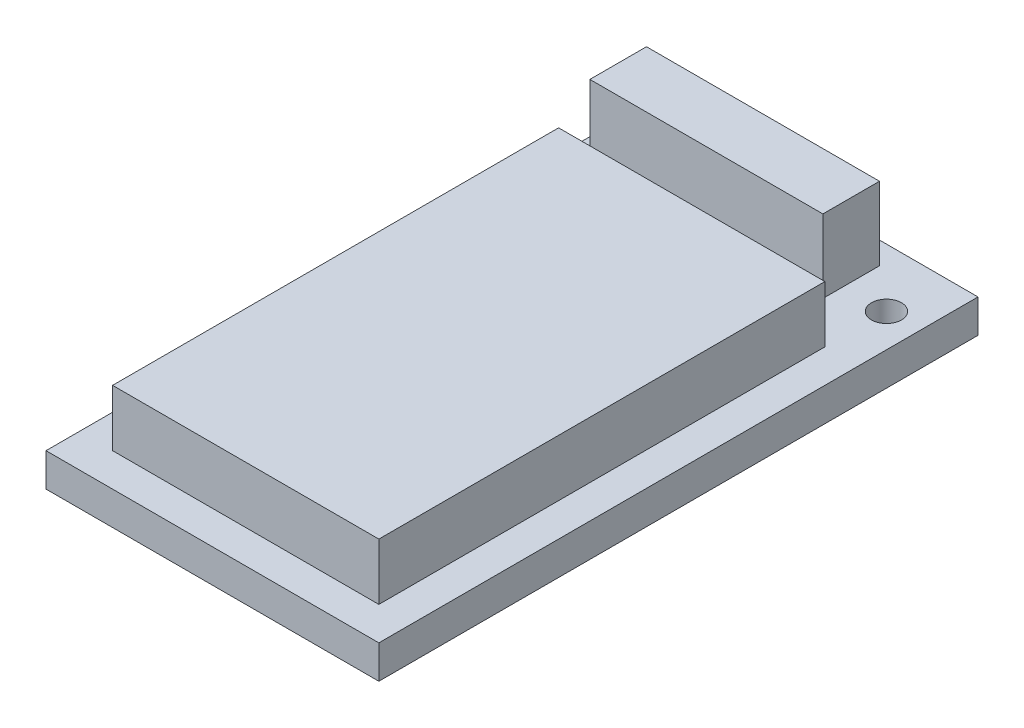
ISO-10303-21;
HEADER;
FILE_DESCRIPTION(('STEP AP214'),'2;1');
FILE_NAME('part.step','',(''),(''),'','','');
FILE_SCHEMA(('AUTOMOTIVE_DESIGN { 1 0 10303 214 1 1 1 1 }'));
ENDSEC;
DATA;
#1=APPLICATION_CONTEXT('core data for automotive mechanical design processes');
#2=APPLICATION_PROTOCOL_DEFINITION('international standard','automotive_design',2000,#1);
#3=PRODUCT_CONTEXT('',#1,'mechanical');
#4=PRODUCT('Part','Part','',(#3));
#5=PRODUCT_RELATED_PRODUCT_CATEGORY('part','',(#4));
#6=PRODUCT_DEFINITION_FORMATION('','',#4);
#7=PRODUCT_DEFINITION_CONTEXT('part definition',#1,'design');
#8=PRODUCT_DEFINITION('design','',#6,#7);
#9=PRODUCT_DEFINITION_SHAPE('','',#8);
#10=(LENGTH_UNIT() NAMED_UNIT(*) SI_UNIT(.MILLI.,.METRE.));
#11=(NAMED_UNIT(*) PLANE_ANGLE_UNIT() SI_UNIT($,.RADIAN.));
#12=(NAMED_UNIT(*) SI_UNIT($,.STERADIAN.) SOLID_ANGLE_UNIT());
#13=UNCERTAINTY_MEASURE_WITH_UNIT(LENGTH_MEASURE(1.E-05),#10,'distance_accuracy_value','');
#14=(GEOMETRIC_REPRESENTATION_CONTEXT(3) GLOBAL_UNCERTAINTY_ASSIGNED_CONTEXT((#13)) GLOBAL_UNIT_ASSIGNED_CONTEXT((#10,
#11,#12)) REPRESENTATION_CONTEXT('',''));
#15=CARTESIAN_POINT('',(0.,0.,0.));
#16=DIRECTION('',(0.,0.,1.));
#17=DIRECTION('',(1.,0.,0.));
#18=AXIS2_PLACEMENT_3D('',#15,#16,#17);
#19=CARTESIAN_POINT('',(0.,1.,0.));
#20=DIRECTION('',(0.,1.,0.));
#21=DIRECTION('',(0.,0.,1.));
#22=AXIS2_PLACEMENT_3D('',#19,#20,#21);
#23=PLANE('',#22);
#24=CARTESIAN_POINT('',(4.,1.,-7.25));
#25=DIRECTION('',(0.,1.,0.));
#26=DIRECTION('',(0.,0.,1.));
#27=AXIS2_PLACEMENT_3D('',#24,#25,#26);
#28=CIRCLE('',#27,0.449999999999987);
#29=CARTESIAN_POINT('',(4.,1.,-6.80000000000001));
#30=VERTEX_POINT('',#29);
#31=EDGE_CURVE('E37',#30,#30,#28,.T.);
#32=ORIENTED_EDGE('',*,*,#31,.F.);
#33=EDGE_LOOP('',(#32));
#34=FACE_BOUND('',#33,.T.);
#35=DIRECTION('',(-1.,0.,0.));
#36=VECTOR('',#35,1.);
#37=CARTESIAN_POINT('',(5.,1.,-9.));
#38=LINE('',#37,#36);
#39=CARTESIAN_POINT('',(5.,1.,-9.));
#40=VERTEX_POINT('',#39);
#41=CARTESIAN_POINT('',(-5.,1.,-9.));
#42=VERTEX_POINT('',#41);
#43=EDGE_CURVE('E180',#40,#42,#38,.T.);
#44=ORIENTED_EDGE('',*,*,#43,.T.);
#45=DIRECTION('',(0.,0.,1.));
#46=VECTOR('',#45,1.);
#47=CARTESIAN_POINT('',(-5.,1.,-9.));
#48=LINE('',#47,#46);
#49=CARTESIAN_POINT('',(-5.,1.,9.));
#50=VERTEX_POINT('',#49);
#51=EDGE_CURVE('E197',#42,#50,#48,.T.);
#52=ORIENTED_EDGE('',*,*,#51,.T.);
#53=DIRECTION('',(1.,0.,0.));
#54=VECTOR('',#53,1.);
#55=CARTESIAN_POINT('',(-5.,1.,9.));
#56=LINE('',#55,#54);
#57=CARTESIAN_POINT('',(5.,1.,9.));
#58=VERTEX_POINT('',#57);
#59=EDGE_CURVE('E200',#50,#58,#56,.T.);
#60=ORIENTED_EDGE('',*,*,#59,.T.);
#61=DIRECTION('',(0.,0.,-1.));
#62=VECTOR('',#61,1.);
#63=CARTESIAN_POINT('',(5.,1.,9.));
#64=LINE('',#63,#62);
#65=EDGE_CURVE('E185',#58,#40,#64,.T.);
#66=ORIENTED_EDGE('',*,*,#65,.T.);
#67=EDGE_LOOP('',(#44,#52,#60,#66));
#68=FACE_BOUND('',#67,.T.);
#69=DIRECTION('',(1.,0.,0.));
#70=VECTOR('',#69,1.);
#71=CARTESIAN_POINT('',(4.,1.,8.));
#72=LINE('',#71,#70);
#73=CARTESIAN_POINT('',(-4.,1.,8.));
#74=VERTEX_POINT('',#73);
#75=CARTESIAN_POINT('',(4.,1.,8.));
#76=VERTEX_POINT('',#75);
#77=EDGE_CURVE('E152',#74,#76,#72,.T.);
#78=ORIENTED_EDGE('',*,*,#77,.F.);
#79=DIRECTION('',(0.,0.,1.));
#80=VECTOR('',#79,1.);
#81=CARTESIAN_POINT('',(-4.,1.,8.));
#82=LINE('',#81,#80);
#83=CARTESIAN_POINT('',(-4.,1.,-5.4));
#84=VERTEX_POINT('',#83);
#85=EDGE_CURVE('E149',#84,#74,#82,.T.);
#86=ORIENTED_EDGE('',*,*,#85,.F.);
#87=DIRECTION('',(-1.,0.,0.));
#88=VECTOR('',#87,1.);
#89=CARTESIAN_POINT('',(-4.,1.,-5.4));
#90=LINE('',#89,#88);
#91=CARTESIAN_POINT('',(4.,1.,-5.4));
#92=VERTEX_POINT('',#91);
#93=EDGE_CURVE('E161',#92,#84,#90,.T.);
#94=ORIENTED_EDGE('',*,*,#93,.F.);
#95=DIRECTION('',(0.,0.,-1.));
#96=VECTOR('',#95,1.);
#97=CARTESIAN_POINT('',(4.,1.,-5.4));
#98=LINE('',#97,#96);
#99=EDGE_CURVE('E169',#76,#92,#98,.T.);
#100=ORIENTED_EDGE('',*,*,#99,.F.);
#101=EDGE_LOOP('',(#78,#86,#94,#100));
#102=FACE_BOUND('',#101,.T.);
#103=DIRECTION('',(1.,0.,0.));
#104=VECTOR('',#103,1.);
#105=CARTESIAN_POINT('',(2.71,1.,-6.63));
#106=LINE('',#105,#104);
#107=CARTESIAN_POINT('',(-4.29,1.,-6.63));
#108=VERTEX_POINT('',#107);
#109=CARTESIAN_POINT('',(2.71,1.,-6.63));
#110=VERTEX_POINT('',#109);
#111=EDGE_CURVE('E292',#108,#110,#106,.T.);
#112=ORIENTED_EDGE('',*,*,#111,.F.);
#113=DIRECTION('',(0.,0.,1.));
#114=VECTOR('',#113,1.);
#115=CARTESIAN_POINT('',(-4.29,1.,-6.63));
#116=LINE('',#115,#114);
#117=CARTESIAN_POINT('',(-4.29,1.,-8.33));
#118=VERTEX_POINT('',#117);
#119=EDGE_CURVE('E147',#118,#108,#116,.T.);
#120=ORIENTED_EDGE('',*,*,#119,.F.);
#121=DIRECTION('',(-1.,0.,0.));
#122=VECTOR('',#121,1.);
#123=CARTESIAN_POINT('',(-4.29,1.,-8.33));
#124=LINE('',#123,#122);
#125=CARTESIAN_POINT('',(2.71,1.,-8.33));
#126=VERTEX_POINT('',#125);
#127=EDGE_CURVE('E143',#126,#118,#124,.T.);
#128=ORIENTED_EDGE('',*,*,#127,.F.);
#129=DIRECTION('',(0.,0.,-1.));
#130=VECTOR('',#129,1.);
#131=CARTESIAN_POINT('',(2.71,1.,-8.33));
#132=LINE('',#131,#130);
#133=EDGE_CURVE('E294',#110,#126,#132,.T.);
#134=ORIENTED_EDGE('',*,*,#133,.F.);
#135=EDGE_LOOP('',(#112,#120,#128,#134));
#136=FACE_BOUND('',#135,.T.);
#137=ADVANCED_FACE('F33',(#34,#68,#102,#136),#23,.T.);
#138=CARTESIAN_POINT('',(5.,0.,-9.));
#139=DIRECTION('',(0.,0.,-1.));
#140=DIRECTION('',(-1.,0.,0.));
#141=AXIS2_PLACEMENT_3D('',#138,#139,#140);
#142=PLANE('',#141);
#143=ORIENTED_EDGE('',*,*,#43,.F.);
#144=DIRECTION('',(0.,1.,0.));
#145=VECTOR('',#144,1.);
#146=CARTESIAN_POINT('',(5.,0.,-9.));
#147=LINE('',#146,#145);
#148=CARTESIAN_POINT('',(5.,0.,-9.));
#149=VERTEX_POINT('',#148);
#150=EDGE_CURVE('E11',#149,#40,#147,.T.);
#151=ORIENTED_EDGE('',*,*,#150,.F.);
#152=DIRECTION('',(-1.,0.,0.));
#153=VECTOR('',#152,1.);
#154=CARTESIAN_POINT('',(5.,0.,-9.));
#155=LINE('',#154,#153);
#156=CARTESIAN_POINT('',(-5.,0.,-9.));
#157=VERTEX_POINT('',#156);
#158=EDGE_CURVE('E181',#149,#157,#155,.T.);
#159=ORIENTED_EDGE('',*,*,#158,.T.);
#160=DIRECTION('',(0.,1.,0.));
#161=VECTOR('',#160,1.);
#162=CARTESIAN_POINT('',(-5.,0.,-9.));
#163=LINE('',#162,#161);
#164=EDGE_CURVE('E194',#157,#42,#163,.T.);
#165=ORIENTED_EDGE('',*,*,#164,.T.);
#166=EDGE_LOOP('',(#143,#151,#159,#165));
#167=FACE_BOUND('',#166,.T.);
#168=ADVANCED_FACE('F35',(#167),#142,.T.);
#169=CARTESIAN_POINT('',(5.,0.,9.));
#170=DIRECTION('',(1.,0.,0.));
#171=DIRECTION('',(0.,0.,-1.));
#172=AXIS2_PLACEMENT_3D('',#169,#170,#171);
#173=PLANE('',#172);
#174=ORIENTED_EDGE('',*,*,#65,.F.);
#175=DIRECTION('',(0.,1.,0.));
#176=VECTOR('',#175,1.);
#177=CARTESIAN_POINT('',(5.,0.,9.));
#178=LINE('',#177,#176);
#179=CARTESIAN_POINT('',(5.,0.,9.));
#180=VERTEX_POINT('',#179);
#181=EDGE_CURVE('E42',#180,#58,#178,.T.);
#182=ORIENTED_EDGE('',*,*,#181,.F.);
#183=DIRECTION('',(0.,0.,-1.));
#184=VECTOR('',#183,1.);
#185=CARTESIAN_POINT('',(5.,0.,9.));
#186=LINE('',#185,#184);
#187=EDGE_CURVE('E191',#180,#149,#186,.T.);
#188=ORIENTED_EDGE('',*,*,#187,.T.);
#189=ORIENTED_EDGE('',*,*,#150,.T.);
#190=EDGE_LOOP('',(#174,#182,#188,#189));
#191=FACE_BOUND('',#190,.T.);
#192=ADVANCED_FACE('F219',(#191),#173,.T.);
#193=CARTESIAN_POINT('',(-5.,0.,9.));
#194=DIRECTION('',(0.,0.,1.));
#195=DIRECTION('',(1.,0.,0.));
#196=AXIS2_PLACEMENT_3D('',#193,#194,#195);
#197=PLANE('',#196);
#198=ORIENTED_EDGE('',*,*,#59,.F.);
#199=DIRECTION('',(0.,1.,0.));
#200=VECTOR('',#199,1.);
#201=CARTESIAN_POINT('',(-5.,0.,9.));
#202=LINE('',#201,#200);
#203=CARTESIAN_POINT('',(-5.,0.,9.));
#204=VERTEX_POINT('',#203);
#205=EDGE_CURVE('E206',#204,#50,#202,.T.);
#206=ORIENTED_EDGE('',*,*,#205,.F.);
#207=DIRECTION('',(1.,0.,0.));
#208=VECTOR('',#207,1.);
#209=CARTESIAN_POINT('',(-5.,0.,9.));
#210=LINE('',#209,#208);
#211=EDGE_CURVE('E188',#204,#180,#210,.T.);
#212=ORIENTED_EDGE('',*,*,#211,.T.);
#213=ORIENTED_EDGE('',*,*,#181,.T.);
#214=EDGE_LOOP('',(#198,#206,#212,#213));
#215=FACE_BOUND('',#214,.T.);
#216=ADVANCED_FACE('F225',(#215),#197,.T.);
#217=CARTESIAN_POINT('',(-5.,0.,-9.));
#218=DIRECTION('',(-1.,0.,0.));
#219=DIRECTION('',(0.,0.,1.));
#220=AXIS2_PLACEMENT_3D('',#217,#218,#219);
#221=PLANE('',#220);
#222=ORIENTED_EDGE('',*,*,#51,.F.);
#223=ORIENTED_EDGE('',*,*,#164,.F.);
#224=DIRECTION('',(0.,0.,1.));
#225=VECTOR('',#224,1.);
#226=CARTESIAN_POINT('',(-5.,0.,-9.));
#227=LINE('',#226,#225);
#228=EDGE_CURVE('E184',#157,#204,#227,.T.);
#229=ORIENTED_EDGE('',*,*,#228,.T.);
#230=ORIENTED_EDGE('',*,*,#205,.T.);
#231=EDGE_LOOP('',(#222,#223,#229,#230));
#232=FACE_BOUND('',#231,.T.);
#233=ADVANCED_FACE('F213',(#232),#221,.T.);
#234=CARTESIAN_POINT('',(0.,0.,0.));
#235=DIRECTION('',(0.,1.,0.));
#236=DIRECTION('',(0.,0.,1.));
#237=AXIS2_PLACEMENT_3D('',#234,#235,#236);
#238=PLANE('',#237);
#239=CARTESIAN_POINT('',(4.,0.,-7.25));
#240=DIRECTION('',(0.,-1.,0.));
#241=DIRECTION('',(0.,0.,-1.));
#242=AXIS2_PLACEMENT_3D('',#239,#240,#241);
#243=CIRCLE('',#242,0.449999999999987);
#244=CARTESIAN_POINT('',(4.,0.,-7.69999999999999));
#245=VERTEX_POINT('',#244);
#246=EDGE_CURVE('E285',#245,#245,#243,.T.);
#247=ORIENTED_EDGE('',*,*,#246,.F.);
#248=EDGE_LOOP('',(#247));
#249=FACE_BOUND('',#248,.T.);
#250=ORIENTED_EDGE('',*,*,#158,.F.);
#251=ORIENTED_EDGE('',*,*,#187,.F.);
#252=ORIENTED_EDGE('',*,*,#211,.F.);
#253=ORIENTED_EDGE('',*,*,#228,.F.);
#254=EDGE_LOOP('',(#250,#251,#252,#253));
#255=FACE_BOUND('',#254,.T.);
#256=ADVANCED_FACE('F222',(#249,#255),#238,.F.);
#257=CARTESIAN_POINT('',(-4.,2.7,8.));
#258=DIRECTION('',(1.,0.,0.));
#259=DIRECTION('',(0.,0.,-1.));
#260=AXIS2_PLACEMENT_3D('',#257,#258,#259);
#261=PLANE('',#260);
#262=ORIENTED_EDGE('',*,*,#85,.T.);
#263=DIRECTION('',(0.,-1.,0.));
#264=VECTOR('',#263,1.);
#265=CARTESIAN_POINT('',(-4.,2.7,8.));
#266=LINE('',#265,#264);
#267=CARTESIAN_POINT('',(-4.,2.7,8.));
#268=VERTEX_POINT('',#267);
#269=EDGE_CURVE('E178',#268,#74,#266,.T.);
#270=ORIENTED_EDGE('',*,*,#269,.F.);
#271=DIRECTION('',(0.,0.,1.));
#272=VECTOR('',#271,1.);
#273=CARTESIAN_POINT('',(-4.,2.7,8.));
#274=LINE('',#273,#272);
#275=CARTESIAN_POINT('',(-4.,2.7,-5.4));
#276=VERTEX_POINT('',#275);
#277=EDGE_CURVE('E157',#276,#268,#274,.T.);
#278=ORIENTED_EDGE('',*,*,#277,.F.);
#279=DIRECTION('',(0.,-1.,0.));
#280=VECTOR('',#279,1.);
#281=CARTESIAN_POINT('',(-4.,2.7,-5.4));
#282=LINE('',#281,#280);
#283=EDGE_CURVE('E166',#276,#84,#282,.T.);
#284=ORIENTED_EDGE('',*,*,#283,.T.);
#285=EDGE_LOOP('',(#262,#270,#278,#284));
#286=FACE_BOUND('',#285,.T.);
#287=ADVANCED_FACE('F243',(#286),#261,.F.);
#288=CARTESIAN_POINT('',(4.,2.7,8.));
#289=DIRECTION('',(0.,0.,-1.));
#290=DIRECTION('',(-1.,0.,0.));
#291=AXIS2_PLACEMENT_3D('',#288,#289,#290);
#292=PLANE('',#291);
#293=ORIENTED_EDGE('',*,*,#77,.T.);
#294=DIRECTION('',(0.,-1.,0.));
#295=VECTOR('',#294,1.);
#296=CARTESIAN_POINT('',(4.,2.7,8.));
#297=LINE('',#296,#295);
#298=CARTESIAN_POINT('',(4.,2.7,8.));
#299=VERTEX_POINT('',#298);
#300=EDGE_CURVE('E175',#299,#76,#297,.T.);
#301=ORIENTED_EDGE('',*,*,#300,.F.);
#302=DIRECTION('',(1.,0.,0.));
#303=VECTOR('',#302,1.);
#304=CARTESIAN_POINT('',(4.,2.7,8.));
#305=LINE('',#304,#303);
#306=EDGE_CURVE('E160',#268,#299,#305,.T.);
#307=ORIENTED_EDGE('',*,*,#306,.F.);
#308=ORIENTED_EDGE('',*,*,#269,.T.);
#309=EDGE_LOOP('',(#293,#301,#307,#308));
#310=FACE_BOUND('',#309,.T.);
#311=ADVANCED_FACE('F247',(#310),#292,.F.);
#312=CARTESIAN_POINT('',(4.,2.7,-5.4));
#313=DIRECTION('',(-1.,0.,0.));
#314=DIRECTION('',(0.,0.,1.));
#315=AXIS2_PLACEMENT_3D('',#312,#313,#314);
#316=PLANE('',#315);
#317=ORIENTED_EDGE('',*,*,#99,.T.);
#318=DIRECTION('',(0.,-1.,0.));
#319=VECTOR('',#318,1.);
#320=CARTESIAN_POINT('',(4.,2.7,-5.4));
#321=LINE('',#320,#319);
#322=CARTESIAN_POINT('',(4.,2.7,-5.4));
#323=VERTEX_POINT('',#322);
#324=EDGE_CURVE('E58',#323,#92,#321,.T.);
#325=ORIENTED_EDGE('',*,*,#324,.F.);
#326=DIRECTION('',(0.,0.,-1.));
#327=VECTOR('',#326,1.);
#328=CARTESIAN_POINT('',(4.,2.7,-5.4));
#329=LINE('',#328,#327);
#330=EDGE_CURVE('E163',#299,#323,#329,.T.);
#331=ORIENTED_EDGE('',*,*,#330,.F.);
#332=ORIENTED_EDGE('',*,*,#300,.T.);
#333=EDGE_LOOP('',(#317,#325,#331,#332));
#334=FACE_BOUND('',#333,.T.);
#335=ADVANCED_FACE('F251',(#334),#316,.F.);
#336=CARTESIAN_POINT('',(-4.,2.7,-5.4));
#337=DIRECTION('',(0.,0.,1.));
#338=DIRECTION('',(1.,0.,0.));
#339=AXIS2_PLACEMENT_3D('',#336,#337,#338);
#340=PLANE('',#339);
#341=ORIENTED_EDGE('',*,*,#93,.T.);
#342=ORIENTED_EDGE('',*,*,#283,.F.);
#343=DIRECTION('',(-1.,0.,0.));
#344=VECTOR('',#343,1.);
#345=CARTESIAN_POINT('',(-4.,2.7,-5.4));
#346=LINE('',#345,#344);
#347=EDGE_CURVE('E165',#323,#276,#346,.T.);
#348=ORIENTED_EDGE('',*,*,#347,.F.);
#349=ORIENTED_EDGE('',*,*,#324,.T.);
#350=EDGE_LOOP('',(#341,#342,#348,#349));
#351=FACE_BOUND('',#350,.T.);
#352=ADVANCED_FACE('F255',(#351),#340,.F.);
#353=CARTESIAN_POINT('',(0.,2.7,0.));
#354=DIRECTION('',(0.,-1.,0.));
#355=DIRECTION('',(0.,0.,-1.));
#356=AXIS2_PLACEMENT_3D('',#353,#354,#355);
#357=PLANE('',#356);
#358=ORIENTED_EDGE('',*,*,#277,.T.);
#359=ORIENTED_EDGE('',*,*,#306,.T.);
#360=ORIENTED_EDGE('',*,*,#330,.T.);
#361=ORIENTED_EDGE('',*,*,#347,.T.);
#362=EDGE_LOOP('',(#358,#359,#360,#361));
#363=FACE_BOUND('',#362,.T.);
#364=ADVANCED_FACE('F259',(#363),#357,.F.);
#365=CARTESIAN_POINT('',(-4.29,3.2,-6.63));
#366=DIRECTION('',(1.,0.,0.));
#367=DIRECTION('',(0.,0.,-1.));
#368=AXIS2_PLACEMENT_3D('',#365,#366,#367);
#369=PLANE('',#368);
#370=ORIENTED_EDGE('',*,*,#119,.T.);
#371=DIRECTION('',(0.,-1.,0.));
#372=VECTOR('',#371,1.);
#373=CARTESIAN_POINT('',(-4.29,3.2,-6.63));
#374=LINE('',#373,#372);
#375=CARTESIAN_POINT('',(-4.29,3.2,-6.63));
#376=VERTEX_POINT('',#375);
#377=EDGE_CURVE('E128',#376,#108,#374,.T.);
#378=ORIENTED_EDGE('',*,*,#377,.F.);
#379=DIRECTION('',(0.,0.,1.));
#380=VECTOR('',#379,1.);
#381=CARTESIAN_POINT('',(-4.29,3.2,-6.63));
#382=LINE('',#381,#380);
#383=CARTESIAN_POINT('',(-4.29,3.2,-8.33));
#384=VERTEX_POINT('',#383);
#385=EDGE_CURVE('E135',#384,#376,#382,.T.);
#386=ORIENTED_EDGE('',*,*,#385,.F.);
#387=DIRECTION('',(0.,-1.,0.));
#388=VECTOR('',#387,1.);
#389=CARTESIAN_POINT('',(-4.29,3.2,-8.33));
#390=LINE('',#389,#388);
#391=EDGE_CURVE('E290',#384,#118,#390,.T.);
#392=ORIENTED_EDGE('',*,*,#391,.T.);
#393=EDGE_LOOP('',(#370,#378,#386,#392));
#394=FACE_BOUND('',#393,.T.);
#395=ADVANCED_FACE('F145',(#394),#369,.F.);
#396=CARTESIAN_POINT('',(2.71,3.2,-6.63));
#397=DIRECTION('',(0.,0.,-1.));
#398=DIRECTION('',(-1.,0.,0.));
#399=AXIS2_PLACEMENT_3D('',#396,#397,#398);
#400=PLANE('',#399);
#401=ORIENTED_EDGE('',*,*,#111,.T.);
#402=DIRECTION('',(0.,-1.,0.));
#403=VECTOR('',#402,1.);
#404=CARTESIAN_POINT('',(2.71,3.2,-6.63));
#405=LINE('',#404,#403);
#406=CARTESIAN_POINT('',(2.71,3.2,-6.63));
#407=VERTEX_POINT('',#406);
#408=EDGE_CURVE('E131',#407,#110,#405,.T.);
#409=ORIENTED_EDGE('',*,*,#408,.F.);
#410=DIRECTION('',(1.,0.,0.));
#411=VECTOR('',#410,1.);
#412=CARTESIAN_POINT('',(2.71,3.2,-6.63));
#413=LINE('',#412,#411);
#414=EDGE_CURVE('E124',#376,#407,#413,.T.);
#415=ORIENTED_EDGE('',*,*,#414,.F.);
#416=ORIENTED_EDGE('',*,*,#377,.T.);
#417=EDGE_LOOP('',(#401,#409,#415,#416));
#418=FACE_BOUND('',#417,.T.);
#419=ADVANCED_FACE('F126',(#418),#400,.F.);
#420=CARTESIAN_POINT('',(2.71,3.2,-8.33));
#421=DIRECTION('',(-1.,0.,0.));
#422=DIRECTION('',(0.,0.,1.));
#423=AXIS2_PLACEMENT_3D('',#420,#421,#422);
#424=PLANE('',#423);
#425=ORIENTED_EDGE('',*,*,#133,.T.);
#426=DIRECTION('',(0.,-1.,0.));
#427=VECTOR('',#426,1.);
#428=CARTESIAN_POINT('',(2.71,3.2,-8.33));
#429=LINE('',#428,#427);
#430=CARTESIAN_POINT('',(2.71,3.2,-8.33));
#431=VERTEX_POINT('',#430);
#432=EDGE_CURVE('E50',#431,#126,#429,.T.);
#433=ORIENTED_EDGE('',*,*,#432,.F.);
#434=DIRECTION('',(0.,0.,-1.));
#435=VECTOR('',#434,1.);
#436=CARTESIAN_POINT('',(2.71,3.2,-8.33));
#437=LINE('',#436,#435);
#438=EDGE_CURVE('E134',#407,#431,#437,.T.);
#439=ORIENTED_EDGE('',*,*,#438,.F.);
#440=ORIENTED_EDGE('',*,*,#408,.T.);
#441=EDGE_LOOP('',(#425,#433,#439,#440));
#442=FACE_BOUND('',#441,.T.);
#443=ADVANCED_FACE('F267',(#442),#424,.F.);
#444=CARTESIAN_POINT('',(-4.29,3.2,-8.33));
#445=DIRECTION('',(0.,0.,1.));
#446=DIRECTION('',(1.,0.,0.));
#447=AXIS2_PLACEMENT_3D('',#444,#445,#446);
#448=PLANE('',#447);
#449=ORIENTED_EDGE('',*,*,#127,.T.);
#450=ORIENTED_EDGE('',*,*,#391,.F.);
#451=DIRECTION('',(-1.,0.,0.));
#452=VECTOR('',#451,1.);
#453=CARTESIAN_POINT('',(-4.29,3.2,-8.33));
#454=LINE('',#453,#452);
#455=EDGE_CURVE('E139',#431,#384,#454,.T.);
#456=ORIENTED_EDGE('',*,*,#455,.F.);
#457=ORIENTED_EDGE('',*,*,#432,.T.);
#458=EDGE_LOOP('',(#449,#450,#456,#457));
#459=FACE_BOUND('',#458,.T.);
#460=ADVANCED_FACE('F270',(#459),#448,.F.);
#461=CARTESIAN_POINT('',(0.,3.2,0.));
#462=DIRECTION('',(0.,-1.,0.));
#463=DIRECTION('',(0.,0.,-1.));
#464=AXIS2_PLACEMENT_3D('',#461,#462,#463);
#465=PLANE('',#464);
#466=ORIENTED_EDGE('',*,*,#385,.T.);
#467=ORIENTED_EDGE('',*,*,#414,.T.);
#468=ORIENTED_EDGE('',*,*,#438,.T.);
#469=ORIENTED_EDGE('',*,*,#455,.T.);
#470=EDGE_LOOP('',(#466,#467,#468,#469));
#471=FACE_BOUND('',#470,.T.);
#472=ADVANCED_FACE('F138',(#471),#465,.F.);
#473=CARTESIAN_POINT('',(4.,0.,-7.25));
#474=DIRECTION('',(0.,-1.,0.));
#475=DIRECTION('',(0.,0.,-1.));
#476=AXIS2_PLACEMENT_3D('',#473,#474,#475);
#477=CYLINDRICAL_SURFACE('',#476,0.449999999999987);
#478=ORIENTED_EDGE('',*,*,#31,.T.);
#479=EDGE_LOOP('',(#478));
#480=FACE_BOUND('',#479,.T.);
#481=ORIENTED_EDGE('',*,*,#246,.T.);
#482=EDGE_LOOP('',(#481));
#483=FACE_BOUND('',#482,.T.);
#484=ADVANCED_FACE('F276',(#480,#483),#477,.F.);
#485=CLOSED_SHELL('',(#137,#168,#192,#216,#233,#256,#287,#311,#335,#352,#364,#395,#419,#443,
#460,#472,#484));
#486=MANIFOLD_SOLID_BREP('B2',#485);
#487=ADVANCED_BREP_SHAPE_REPRESENTATION('',(#18,#486),#14);
#488=SHAPE_DEFINITION_REPRESENTATION(#9,#487);
ENDSEC;
END-ISO-10303-21;
